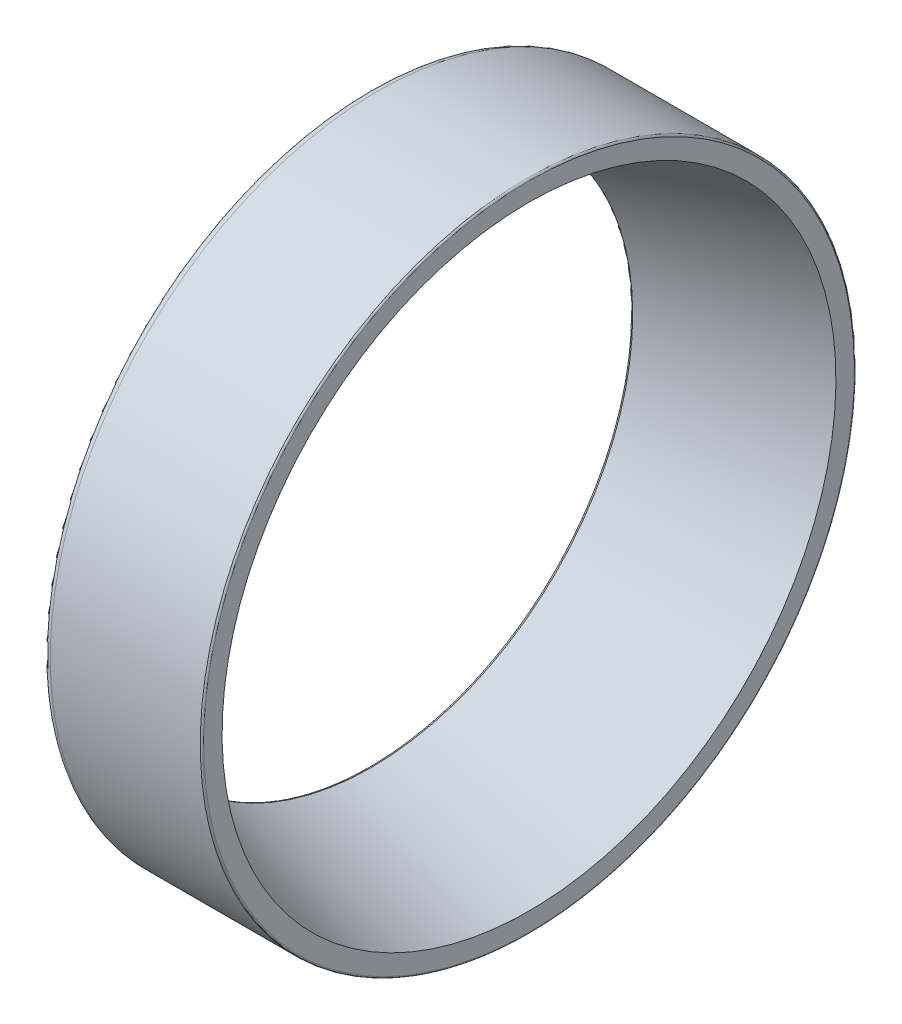
ISO-10303-21;
HEADER;
FILE_DESCRIPTION(('STEP AP214'),'2;1');
FILE_NAME('part.step','',(''),(''),'','','');
FILE_SCHEMA(('AUTOMOTIVE_DESIGN { 1 0 10303 214 1 1 1 1 }'));
ENDSEC;
DATA;
#1=APPLICATION_CONTEXT('core data for automotive mechanical design processes');
#2=APPLICATION_PROTOCOL_DEFINITION('international standard','automotive_design',2000,#1);
#3=PRODUCT_CONTEXT('',#1,'mechanical');
#4=PRODUCT('Part','Part','',(#3));
#5=PRODUCT_RELATED_PRODUCT_CATEGORY('part','',(#4));
#6=PRODUCT_DEFINITION_FORMATION('','',#4);
#7=PRODUCT_DEFINITION_CONTEXT('part definition',#1,'design');
#8=PRODUCT_DEFINITION('design','',#6,#7);
#9=PRODUCT_DEFINITION_SHAPE('','',#8);
#10=(LENGTH_UNIT() NAMED_UNIT(*) SI_UNIT(.MILLI.,.METRE.));
#11=(NAMED_UNIT(*) PLANE_ANGLE_UNIT() SI_UNIT($,.RADIAN.));
#12=(NAMED_UNIT(*) SI_UNIT($,.STERADIAN.) SOLID_ANGLE_UNIT());
#13=UNCERTAINTY_MEASURE_WITH_UNIT(LENGTH_MEASURE(1.E-05),#10,'distance_accuracy_value','');
#14=(GEOMETRIC_REPRESENTATION_CONTEXT(3) GLOBAL_UNCERTAINTY_ASSIGNED_CONTEXT((#13)) GLOBAL_UNIT_ASSIGNED_CONTEXT((#10,
#11,#12)) REPRESENTATION_CONTEXT('',''));
#15=CARTESIAN_POINT('',(0.,0.,0.));
#16=DIRECTION('',(0.,0.,1.));
#17=DIRECTION('',(1.,0.,0.));
#18=AXIS2_PLACEMENT_3D('',#15,#16,#17);
#19=CARTESIAN_POINT('',(0.12,0.,0.));
#20=DIRECTION('',(1.,0.,0.));
#21=DIRECTION('',(0.,0.,-1.));
#22=AXIS2_PLACEMENT_3D('',#19,#20,#21);
#23=TOROIDAL_SURFACE('',#22,18.9159432188522,0.12);
#24=CARTESIAN_POINT('',(0.15307648269804,0.,0.));
#25=DIRECTION('',(1.,0.,0.));
#26=DIRECTION('',(0.,1.,0.));
#27=AXIS2_PLACEMENT_3D('',#24,#25,#26);
#28=CIRCLE('',#27,18.8005918153396);
#29=CARTESIAN_POINT('',(0.15307648269804,18.8005918153396,0.));
#30=VERTEX_POINT('',#29);
#31=EDGE_CURVE('E11',#30,#30,#28,.T.);
#32=ORIENTED_EDGE('',*,*,#31,.T.);
#33=EDGE_LOOP('',(#32));
#34=FACE_BOUND('',#33,.T.);
#35=CARTESIAN_POINT('',(0.,0.,0.));
#36=DIRECTION('',(1.,0.,0.));
#37=DIRECTION('',(0.,1.,0.));
#38=AXIS2_PLACEMENT_3D('',#35,#36,#37);
#39=CIRCLE('',#38,18.9159432188522);
#40=CARTESIAN_POINT('',(0.,18.9159432188522,0.));
#41=VERTEX_POINT('',#40);
#42=EDGE_CURVE('E55',#41,#41,#39,.T.);
#43=ORIENTED_EDGE('',*,*,#42,.F.);
#44=EDGE_LOOP('',(#43));
#45=FACE_BOUND('',#44,.T.);
#46=ADVANCED_FACE('F17',(#34,#45),#23,.T.);
#47=CARTESIAN_POINT('',(5.82653824134902,0.,0.));
#48=DIRECTION('',(1.,0.,0.));
#49=DIRECTION('',(0.,1.,0.));
#50=AXIS2_PLACEMENT_3D('',#47,#48,#49);
#51=CONICAL_SURFACE('',#50,20.4274307959118,0.279252680319093);
#52=CARTESIAN_POINT('',(11.5,0.,0.));
#53=DIRECTION('',(1.,0.,0.));
#54=DIRECTION('',(0.,1.,0.));
#55=AXIS2_PLACEMENT_3D('',#52,#53,#54);
#56=CIRCLE('',#55,22.0542697764841);
#57=CARTESIAN_POINT('',(11.5,22.0542697764841,0.));
#58=VERTEX_POINT('',#57);
#59=EDGE_CURVE('E24',#58,#58,#56,.T.);
#60=ORIENTED_EDGE('',*,*,#59,.T.);
#61=EDGE_LOOP('',(#60));
#62=FACE_BOUND('',#61,.T.);
#63=ORIENTED_EDGE('',*,*,#31,.F.);
#64=EDGE_LOOP('',(#63));
#65=FACE_BOUND('',#64,.T.);
#66=ADVANCED_FACE('F78',(#62,#65),#51,.F.);
#67=CARTESIAN_POINT('',(11.5,22.7171348882421,0.));
#68=DIRECTION('',(1.,0.,0.));
#69=DIRECTION('',(0.,1.,0.));
#70=AXIS2_PLACEMENT_3D('',#67,#68,#69);
#71=PLANE('',#70);
#72=CARTESIAN_POINT('',(11.5,0.,0.));
#73=DIRECTION('',(1.,0.,0.));
#74=DIRECTION('',(0.,1.,0.));
#75=AXIS2_PLACEMENT_3D('',#72,#73,#74);
#76=CIRCLE('',#75,23.38);
#77=CARTESIAN_POINT('',(11.5,23.38,0.));
#78=VERTEX_POINT('',#77);
#79=EDGE_CURVE('E52',#78,#78,#76,.T.);
#80=ORIENTED_EDGE('',*,*,#79,.T.);
#81=EDGE_LOOP('',(#80));
#82=FACE_BOUND('',#81,.T.);
#83=ORIENTED_EDGE('',*,*,#59,.F.);
#84=EDGE_LOOP('',(#83));
#85=FACE_BOUND('',#84,.T.);
#86=ADVANCED_FACE('F82',(#82,#85),#71,.T.);
#87=CARTESIAN_POINT('',(11.38,0.,0.));
#88=DIRECTION('',(1.,0.,0.));
#89=DIRECTION('',(0.,0.,-1.));
#90=AXIS2_PLACEMENT_3D('',#87,#88,#89);
#91=TOROIDAL_SURFACE('',#90,23.38,0.12);
#92=CARTESIAN_POINT('',(11.38,0.,0.));
#93=DIRECTION('',(1.,0.,0.));
#94=DIRECTION('',(0.,1.,0.));
#95=AXIS2_PLACEMENT_3D('',#92,#93,#94);
#96=CIRCLE('',#95,23.5);
#97=CARTESIAN_POINT('',(11.38,23.5,0.));
#98=VERTEX_POINT('',#97);
#99=EDGE_CURVE('E48',#98,#98,#96,.T.);
#100=ORIENTED_EDGE('',*,*,#99,.T.);
#101=EDGE_LOOP('',(#100));
#102=FACE_BOUND('',#101,.T.);
#103=ORIENTED_EDGE('',*,*,#79,.F.);
#104=EDGE_LOOP('',(#103));
#105=FACE_BOUND('',#104,.T.);
#106=ADVANCED_FACE('F49',(#102,#105),#91,.T.);
#107=CARTESIAN_POINT('',(5.99,0.,0.));
#108=DIRECTION('',(-1.,0.,0.));
#109=DIRECTION('',(0.,1.,0.));
#110=AXIS2_PLACEMENT_3D('',#107,#108,#109);
#111=CYLINDRICAL_SURFACE('',#110,23.5);
#112=CARTESIAN_POINT('',(0.6,0.,0.));
#113=DIRECTION('',(1.,0.,0.));
#114=DIRECTION('',(0.,1.,0.));
#115=AXIS2_PLACEMENT_3D('',#112,#113,#114);
#116=CIRCLE('',#115,23.5);
#117=CARTESIAN_POINT('',(0.6,23.5,0.));
#118=VERTEX_POINT('',#117);
#119=EDGE_CURVE('E53',#118,#118,#116,.T.);
#120=ORIENTED_EDGE('',*,*,#119,.T.);
#121=EDGE_LOOP('',(#120));
#122=FACE_BOUND('',#121,.T.);
#123=ORIENTED_EDGE('',*,*,#99,.F.);
#124=EDGE_LOOP('',(#123));
#125=FACE_BOUND('',#124,.T.);
#126=ADVANCED_FACE('F74',(#122,#125),#111,.T.);
#127=CARTESIAN_POINT('',(0.6,0.,0.));
#128=DIRECTION('',(1.,0.,0.));
#129=DIRECTION('',(0.,0.,-1.));
#130=AXIS2_PLACEMENT_3D('',#127,#128,#129);
#131=TOROIDAL_SURFACE('',#130,22.9,0.6);
#132=CARTESIAN_POINT('',(0.,0.,0.));
#133=DIRECTION('',(1.,0.,0.));
#134=DIRECTION('',(0.,1.,0.));
#135=AXIS2_PLACEMENT_3D('',#132,#133,#134);
#136=CIRCLE('',#135,22.9);
#137=CARTESIAN_POINT('',(0.,22.9,0.));
#138=VERTEX_POINT('',#137);
#139=EDGE_CURVE('E59',#138,#138,#136,.T.);
#140=ORIENTED_EDGE('',*,*,#139,.T.);
#141=EDGE_LOOP('',(#140));
#142=FACE_BOUND('',#141,.T.);
#143=ORIENTED_EDGE('',*,*,#119,.F.);
#144=EDGE_LOOP('',(#143));
#145=FACE_BOUND('',#144,.T.);
#146=ADVANCED_FACE('F63',(#142,#145),#131,.T.);
#147=CARTESIAN_POINT('',(0.,20.9079716094261,0.));
#148=DIRECTION('',(-1.,0.,0.));
#149=DIRECTION('',(0.,-1.,0.));
#150=AXIS2_PLACEMENT_3D('',#147,#148,#149);
#151=PLANE('',#150);
#152=ORIENTED_EDGE('',*,*,#42,.T.);
#153=EDGE_LOOP('',(#152));
#154=FACE_BOUND('',#153,.T.);
#155=ORIENTED_EDGE('',*,*,#139,.F.);
#156=EDGE_LOOP('',(#155));
#157=FACE_BOUND('',#156,.T.);
#158=ADVANCED_FACE('F66',(#154,#157),#151,.T.);
#159=CLOSED_SHELL('',(#46,#66,#86,#106,#126,#146,#158));
#160=MANIFOLD_SOLID_BREP('B1',#159);
#161=ADVANCED_BREP_SHAPE_REPRESENTATION('',(#18,#160),#14);
#162=SHAPE_DEFINITION_REPRESENTATION(#9,#161);
ENDSEC;
END-ISO-10303-21;
